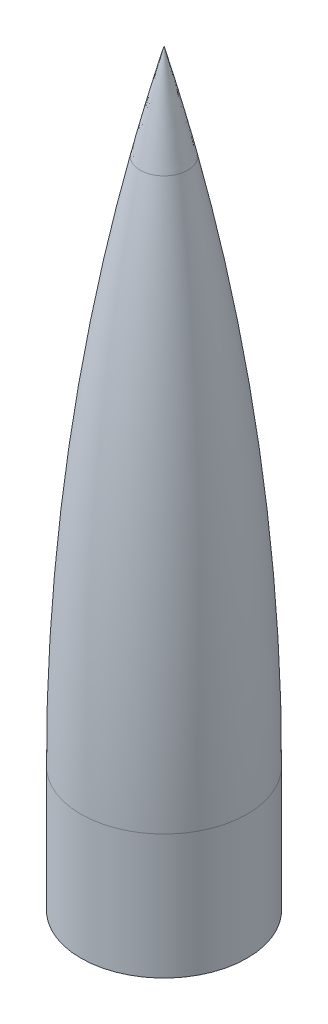
ISO-10303-21;
HEADER;
FILE_DESCRIPTION(('STEP AP214'),'2;1');
FILE_NAME('part.step','',(''),(''),'','','');
FILE_SCHEMA(('AUTOMOTIVE_DESIGN { 1 0 10303 214 1 1 1 1 }'));
ENDSEC;
DATA;
#1=APPLICATION_CONTEXT('core data for automotive mechanical design processes');
#2=APPLICATION_PROTOCOL_DEFINITION('international standard','automotive_design',2000,#1);
#3=PRODUCT_CONTEXT('',#1,'mechanical');
#4=PRODUCT('Part','Part','',(#3));
#5=PRODUCT_RELATED_PRODUCT_CATEGORY('part','',(#4));
#6=PRODUCT_DEFINITION_FORMATION('','',#4);
#7=PRODUCT_DEFINITION_CONTEXT('part definition',#1,'design');
#8=PRODUCT_DEFINITION('design','',#6,#7);
#9=PRODUCT_DEFINITION_SHAPE('','',#8);
#10=(LENGTH_UNIT() NAMED_UNIT(*) SI_UNIT(.MILLI.,.METRE.));
#11=(NAMED_UNIT(*) PLANE_ANGLE_UNIT() SI_UNIT($,.RADIAN.));
#12=(NAMED_UNIT(*) SI_UNIT($,.STERADIAN.) SOLID_ANGLE_UNIT());
#13=UNCERTAINTY_MEASURE_WITH_UNIT(LENGTH_MEASURE(1.E-05),#10,'distance_accuracy_value','');
#14=(GEOMETRIC_REPRESENTATION_CONTEXT(3) GLOBAL_UNCERTAINTY_ASSIGNED_CONTEXT((#13)) GLOBAL_UNIT_ASSIGNED_CONTEXT((#10,
#11,#12)) REPRESENTATION_CONTEXT('',''));
#15=CARTESIAN_POINT('',(0.,0.,0.));
#16=DIRECTION('',(0.,0.,1.));
#17=DIRECTION('',(1.,0.,0.));
#18=AXIS2_PLACEMENT_3D('',#15,#16,#17);
#19=CARTESIAN_POINT('',(1403.35,76.2,0.));
#20=DIRECTION('',(0.,0.,-1.));
#21=DIRECTION('',(-1.,0.,0.));
#22=AXIS2_PLACEMENT_3D('',#19,#20,#21);
#23=CIRCLE('',#22,1454.15);
#24=TRIMMED_CURVE('',#23,(PARAMETER_VALUE(-0.265103064593347)),
(PARAMETER_VALUE(0.265103064593347)),.T.,.PARAMETER.);
#25=CARTESIAN_POINT('',(-4.44089209850063E-13,76.2000000000019,0.));
#26=DIRECTION('',(0.,1.,0.));
#27=AXIS1_PLACEMENT('',#25,#26);
#28=SURFACE_OF_REVOLUTION('',#24,#27);
#29=CARTESIAN_POINT('',(0.,398.78,0.));
#30=DIRECTION('',(0.,1.,0.));
#31=DIRECTION('',(-1.,0.,0.));
#32=AXIS2_PLACEMENT_3D('',#29,#30,#31);
#33=CIRCLE('',#32,14.569026637276);
#34=CARTESIAN_POINT('',(-14.569026637276,398.78,0.));
#35=VERTEX_POINT('',#34);
#36=EDGE_CURVE('E12',#35,#35,#33,.T.);
#37=ORIENTED_EDGE('',*,*,#36,.T.);
#38=EDGE_LOOP('',(#37));
#39=FACE_BOUND('',#38,.T.);
#40=CARTESIAN_POINT('',(0.,457.2,0.));
#41=VERTEX_POINT('',#40);
#42=VERTEX_LOOP('',#41);
#43=FACE_BOUND('',#42,.T.);
#44=ADVANCED_FACE('F49',(#39,#43),#28,.T.);
#45=CARTESIAN_POINT('',(0.,398.78,0.));
#46=DIRECTION('',(0.,1.,0.));
#47=DIRECTION('',(-1.,0.,0.));
#48=AXIS2_PLACEMENT_3D('',#45,#46,#47);
#49=PLANE('',#48);
#50=ORIENTED_EDGE('',*,*,#36,.F.);
#51=EDGE_LOOP('',(#50));
#52=FACE_BOUND('',#51,.T.);
#53=ADVANCED_FACE('F57',(#52),#49,.F.);
#54=CLOSED_SHELL('',(#44,#53));
#55=MANIFOLD_SOLID_BREP('B2',#54);
#56=CARTESIAN_POINT('',(0.,0.,0.));
#57=DIRECTION('',(0.,-1.,0.));
#58=DIRECTION('',(0.,0.,-1.));
#59=AXIS2_PLACEMENT_3D('',#56,#57,#58);
#60=CYLINDRICAL_SURFACE('',#59,49.53);
#61=CARTESIAN_POINT('',(0.,76.2,0.));
#62=DIRECTION('',(0.,-1.,0.));
#63=DIRECTION('',(0.,0.,-1.));
#64=AXIS2_PLACEMENT_3D('',#61,#62,#63);
#65=CIRCLE('',#64,49.5300000000001);
#66=CARTESIAN_POINT('',(0.,76.2,-49.5300000000001));
#67=VERTEX_POINT('',#66);
#68=EDGE_CURVE('E48',#67,#67,#65,.T.);
#69=ORIENTED_EDGE('',*,*,#68,.F.);
#70=EDGE_LOOP('',(#69));
#71=FACE_BOUND('',#70,.T.);
#72=CARTESIAN_POINT('',(0.,0.,0.));
#73=DIRECTION('',(0.,-1.,0.));
#74=DIRECTION('',(0.,0.,-1.));
#75=AXIS2_PLACEMENT_3D('',#72,#73,#74);
#76=CIRCLE('',#75,49.53);
#77=CARTESIAN_POINT('',(0.,0.,-49.53));
#78=VERTEX_POINT('',#77);
#79=EDGE_CURVE('E101',#78,#78,#76,.T.);
#80=ORIENTED_EDGE('',*,*,#79,.T.);
#81=EDGE_LOOP('',(#80));
#82=FACE_BOUND('',#81,.T.);
#83=ADVANCED_FACE('F79',(#71,#82),#60,.F.);
#84=CARTESIAN_POINT('',(0.,76.2,0.));
#85=DIRECTION('',(0.,-1.,0.));
#86=DIRECTION('',(0.,0.,-1.));
#87=AXIS2_PLACEMENT_3D('',#84,#85,#86);
#88=DEGENERATE_TOROIDAL_SURFACE('',#87,1403.35,1452.88,.F.);
#89=CARTESIAN_POINT('',(0.,398.78,0.));
#90=DIRECTION('',(0.,-1.,0.));
#91=DIRECTION('',(0.,0.,-1.));
#92=AXIS2_PLACEMENT_3D('',#89,#90,#91);
#93=CIRCLE('',#92,13.2665458584762);
#94=CARTESIAN_POINT('',(0.,398.78,-13.2665458584762));
#95=VERTEX_POINT('',#94);
#96=EDGE_CURVE('E85',#95,#95,#93,.T.);
#97=ORIENTED_EDGE('',*,*,#96,.F.);
#98=EDGE_LOOP('',(#97));
#99=FACE_BOUND('',#98,.T.);
#100=ORIENTED_EDGE('',*,*,#68,.T.);
#101=EDGE_LOOP('',(#100));
#102=FACE_BOUND('',#101,.T.);
#103=ADVANCED_FACE('F124',(#99,#102),#88,.T.);
#104=CARTESIAN_POINT('',(0.,398.78,0.));
#105=DIRECTION('',(0.,-1.,0.));
#106=DIRECTION('',(0.,0.,-1.));
#107=AXIS2_PLACEMENT_3D('',#104,#105,#106);
#108=PLANE('',#107);
#109=CARTESIAN_POINT('',(0.,398.78,0.));
#110=DIRECTION('',(0.,-1.,0.));
#111=DIRECTION('',(0.,0.,-1.));
#112=AXIS2_PLACEMENT_3D('',#109,#110,#111);
#113=CIRCLE('',#112,14.569026637276);
#114=CARTESIAN_POINT('',(0.,398.78,-14.569026637276));
#115=VERTEX_POINT('',#114);
#116=EDGE_CURVE('E89',#115,#115,#113,.T.);
#117=ORIENTED_EDGE('',*,*,#116,.F.);
#118=EDGE_LOOP('',(#117));
#119=FACE_BOUND('',#118,.T.);
#120=ORIENTED_EDGE('',*,*,#96,.T.);
#121=EDGE_LOOP('',(#120));
#122=FACE_BOUND('',#121,.T.);
#123=ADVANCED_FACE('F120',(#119,#122),#108,.F.);
#124=CARTESIAN_POINT('',(0.,76.2,0.));
#125=DIRECTION('',(0.,-1.,0.));
#126=DIRECTION('',(0.,0.,-1.));
#127=AXIS2_PLACEMENT_3D('',#124,#125,#126);
#128=DEGENERATE_TOROIDAL_SURFACE('',#127,1403.35,1454.15,.F.);
#129=ORIENTED_EDGE('',*,*,#116,.T.);
#130=EDGE_LOOP('',(#129));
#131=FACE_BOUND('',#130,.T.);
#132=CARTESIAN_POINT('',(0.,76.2,0.));
#133=DIRECTION('',(0.,-1.,0.));
#134=DIRECTION('',(0.,0.,-1.));
#135=AXIS2_PLACEMENT_3D('',#132,#133,#134);
#136=CIRCLE('',#135,50.8);
#137=CARTESIAN_POINT('',(0.,76.2,-50.8));
#138=VERTEX_POINT('',#137);
#139=EDGE_CURVE('E93',#138,#138,#136,.T.);
#140=ORIENTED_EDGE('',*,*,#139,.F.);
#141=EDGE_LOOP('',(#140));
#142=FACE_BOUND('',#141,.T.);
#143=ADVANCED_FACE('F114',(#131,#142),#128,.F.);
#144=CARTESIAN_POINT('',(0.,0.,0.));
#145=DIRECTION('',(0.,-1.,0.));
#146=DIRECTION('',(0.,0.,-1.));
#147=AXIS2_PLACEMENT_3D('',#144,#145,#146);
#148=CYLINDRICAL_SURFACE('',#147,50.8);
#149=ORIENTED_EDGE('',*,*,#139,.T.);
#150=EDGE_LOOP('',(#149));
#151=FACE_BOUND('',#150,.T.);
#152=CARTESIAN_POINT('',(0.,0.,0.));
#153=DIRECTION('',(0.,-1.,0.));
#154=DIRECTION('',(0.,0.,-1.));
#155=AXIS2_PLACEMENT_3D('',#152,#153,#154);
#156=CIRCLE('',#155,50.8);
#157=CARTESIAN_POINT('',(0.,0.,-50.8));
#158=VERTEX_POINT('',#157);
#159=EDGE_CURVE('E98',#158,#158,#156,.T.);
#160=ORIENTED_EDGE('',*,*,#159,.F.);
#161=EDGE_LOOP('',(#160));
#162=FACE_BOUND('',#161,.T.);
#163=ADVANCED_FACE('F109',(#151,#162),#148,.T.);
#164=CARTESIAN_POINT('',(0.,0.,0.));
#165=DIRECTION('',(0.,1.,0.));
#166=DIRECTION('',(0.,0.,1.));
#167=AXIS2_PLACEMENT_3D('',#164,#165,#166);
#168=PLANE('',#167);
#169=ORIENTED_EDGE('',*,*,#79,.F.);
#170=EDGE_LOOP('',(#169));
#171=FACE_BOUND('',#170,.T.);
#172=ORIENTED_EDGE('',*,*,#159,.T.);
#173=EDGE_LOOP('',(#172));
#174=FACE_BOUND('',#173,.T.);
#175=ADVANCED_FACE('F106',(#171,#174),#168,.F.);
#176=CLOSED_SHELL('',(#83,#103,#123,#143,#163,#175));
#177=MANIFOLD_SOLID_BREP('B6',#176);
#178=ADVANCED_BREP_SHAPE_REPRESENTATION('',(#18,#55,#177),#14);
#179=SHAPE_DEFINITION_REPRESENTATION(#9,#178);
ENDSEC;
END-ISO-10303-21;
